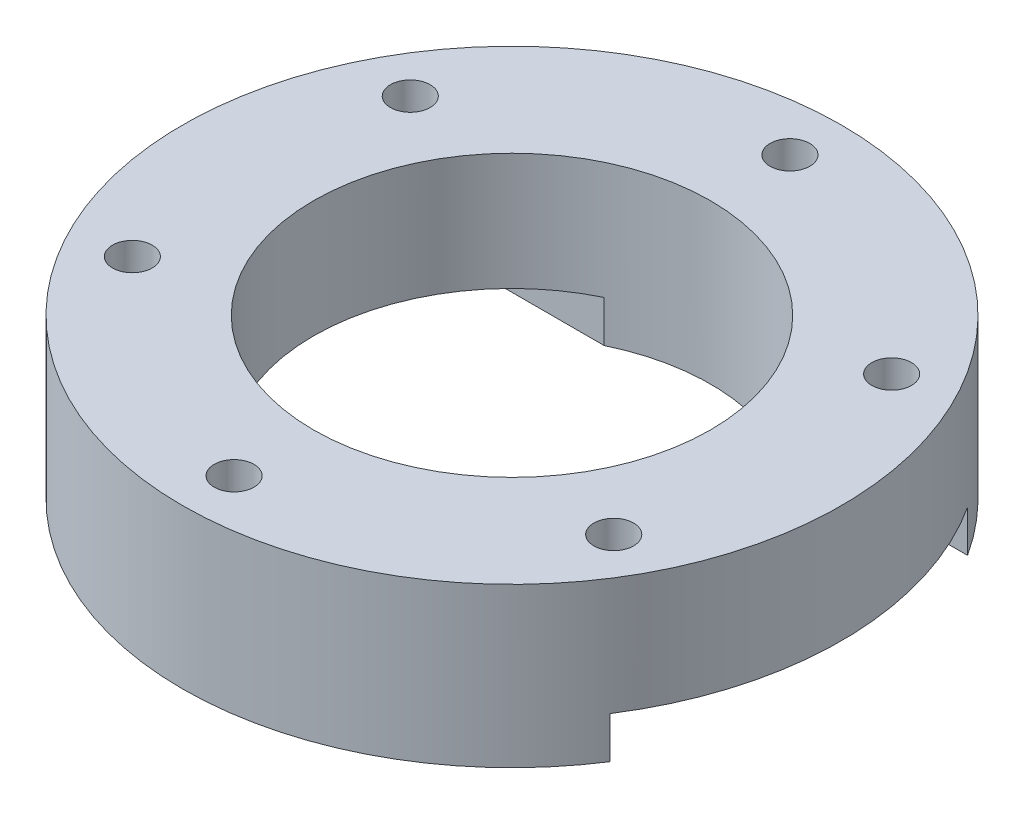
ISO-10303-21;
HEADER;
FILE_DESCRIPTION(('STEP AP214'),'2;1');
FILE_NAME('part.step','',(''),(''),'','','');
FILE_SCHEMA(('AUTOMOTIVE_DESIGN { 1 0 10303 214 1 1 1 1 }'));
ENDSEC;
DATA;
#1=APPLICATION_CONTEXT('core data for automotive mechanical design processes');
#2=APPLICATION_PROTOCOL_DEFINITION('international standard','automotive_design',2000,#1);
#3=PRODUCT_CONTEXT('',#1,'mechanical');
#4=PRODUCT('Part','Part','',(#3));
#5=PRODUCT_RELATED_PRODUCT_CATEGORY('part','',(#4));
#6=PRODUCT_DEFINITION_FORMATION('','',#4);
#7=PRODUCT_DEFINITION_CONTEXT('part definition',#1,'design');
#8=PRODUCT_DEFINITION('design','',#6,#7);
#9=PRODUCT_DEFINITION_SHAPE('','',#8);
#10=(LENGTH_UNIT() NAMED_UNIT(*) SI_UNIT(.MILLI.,.METRE.));
#11=(NAMED_UNIT(*) PLANE_ANGLE_UNIT() SI_UNIT($,.RADIAN.));
#12=(NAMED_UNIT(*) SI_UNIT($,.STERADIAN.) SOLID_ANGLE_UNIT());
#13=UNCERTAINTY_MEASURE_WITH_UNIT(LENGTH_MEASURE(1.E-05),#10,'distance_accuracy_value','');
#14=(GEOMETRIC_REPRESENTATION_CONTEXT(3) GLOBAL_UNCERTAINTY_ASSIGNED_CONTEXT((#13)) GLOBAL_UNIT_ASSIGNED_CONTEXT((#10,
#11,#12)) REPRESENTATION_CONTEXT('',''));
#15=CARTESIAN_POINT('',(0.,0.,0.));
#16=DIRECTION('',(0.,0.,1.));
#17=DIRECTION('',(1.,0.,0.));
#18=AXIS2_PLACEMENT_3D('',#15,#16,#17);
#19=CARTESIAN_POINT('',(0.,0.,0.));
#20=DIRECTION('',(0.,1.,0.));
#21=DIRECTION('',(0.,0.,1.));
#22=AXIS2_PLACEMENT_3D('',#19,#20,#21);
#23=PLANE('',#22);
#24=CARTESIAN_POINT('',(2.97570696259839E-12,0.,35.));
#25=DIRECTION('',(0.,1.,0.));
#26=DIRECTION('',(0.,0.,1.));
#27=AXIS2_PLACEMENT_3D('',#24,#25,#26);
#28=CIRCLE('',#27,2.5);
#29=CARTESIAN_POINT('',(2.97570696259839E-12,0.,37.5));
#30=VERTEX_POINT('',#29);
#31=EDGE_CURVE('E171',#30,#30,#28,.T.);
#32=ORIENTED_EDGE('',*,*,#31,.T.);
#33=EDGE_LOOP('',(#32));
#34=FACE_BOUND('',#33,.T.);
#35=CARTESIAN_POINT('',(0.,0.,0.));
#36=DIRECTION('',(0.,1.,0.));
#37=DIRECTION('',(0.,0.,1.));
#38=AXIS2_PLACEMENT_3D('',#35,#36,#37);
#39=CIRCLE('',#38,41.5);
#40=CARTESIAN_POINT('',(-34.8711915483254,0.,22.5));
#41=VERTEX_POINT('',#40);
#42=CARTESIAN_POINT('',(34.8711915483254,0.,22.5));
#43=VERTEX_POINT('',#42);
#44=EDGE_CURVE('E125',#41,#43,#39,.T.);
#45=ORIENTED_EDGE('',*,*,#44,.F.);
#46=DIRECTION('',(-1.,0.,0.));
#47=VECTOR('',#46,1.);
#48=CARTESIAN_POINT('',(45.,0.,22.5));
#49=LINE('',#48,#47);
#50=CARTESIAN_POINT('',(-10.8972473588517,0.,22.5));
#51=VERTEX_POINT('',#50);
#52=EDGE_CURVE('E117',#51,#41,#49,.T.);
#53=ORIENTED_EDGE('',*,*,#52,.F.);
#54=CARTESIAN_POINT('',(0.,0.,0.));
#55=DIRECTION('',(0.,1.,0.));
#56=DIRECTION('',(0.,0.,1.));
#57=AXIS2_PLACEMENT_3D('',#54,#55,#56);
#58=CIRCLE('',#57,25.);
#59=CARTESIAN_POINT('',(10.8972473588517,0.,22.5));
#60=VERTEX_POINT('',#59);
#61=EDGE_CURVE('E183',#51,#60,#58,.T.);
#62=ORIENTED_EDGE('',*,*,#61,.T.);
#63=EDGE_CURVE('E271',#43,#60,#49,.T.);
#64=ORIENTED_EDGE('',*,*,#63,.F.);
#65=EDGE_LOOP('',(#45,#53,#62,#64));
#66=FACE_BOUND('',#65,.T.);
#67=ADVANCED_FACE('F33',(#34,#66),#23,.F.);
#68=CARTESIAN_POINT('',(30.3108891324561,0.,-17.5000000000013));
#69=DIRECTION('',(0.,1.,0.));
#70=DIRECTION('',(0.,0.,1.));
#71=AXIS2_PLACEMENT_3D('',#68,#69,#70);
#72=CYLINDRICAL_SURFACE('',#71,2.5);
#73=CARTESIAN_POINT('',(30.3108891324561,20.,-17.5000000000013));
#74=DIRECTION('',(0.,1.,0.));
#75=DIRECTION('',(0.,0.,1.));
#76=AXIS2_PLACEMENT_3D('',#73,#74,#75);
#77=CIRCLE('',#76,2.5);
#78=CARTESIAN_POINT('',(30.3108891324561,20.,-15.0000000000013));
#79=VERTEX_POINT('',#78);
#80=EDGE_CURVE('E179',#79,#79,#77,.T.);
#81=ORIENTED_EDGE('',*,*,#80,.T.);
#82=EDGE_LOOP('',(#81));
#83=FACE_BOUND('',#82,.T.);
#84=CARTESIAN_POINT('',(30.3108891324561,5.25,-17.5000000000013));
#85=DIRECTION('',(0.,-1.,0.));
#86=DIRECTION('',(0.,0.,-1.));
#87=AXIS2_PLACEMENT_3D('',#84,#85,#86);
#88=CIRCLE('',#87,2.5);
#89=CARTESIAN_POINT('',(30.3108891324561,5.25,-20.0000000000013));
#90=VERTEX_POINT('',#89);
#91=EDGE_CURVE('E153',#90,#90,#88,.F.);
#92=ORIENTED_EDGE('',*,*,#91,.F.);
#93=EDGE_LOOP('',(#92));
#94=FACE_BOUND('',#93,.T.);
#95=ADVANCED_FACE('F210',(#83,#94),#72,.F.);
#96=CARTESIAN_POINT('',(30.3108891324576,0.,17.4999999999987));
#97=DIRECTION('',(0.,1.,0.));
#98=DIRECTION('',(0.,0.,1.));
#99=AXIS2_PLACEMENT_3D('',#96,#97,#98);
#100=CYLINDRICAL_SURFACE('',#99,2.5);
#101=CARTESIAN_POINT('',(30.3108891324576,20.,17.4999999999987));
#102=DIRECTION('',(0.,1.,0.));
#103=DIRECTION('',(0.,0.,1.));
#104=AXIS2_PLACEMENT_3D('',#101,#102,#103);
#105=CIRCLE('',#104,2.5);
#106=CARTESIAN_POINT('',(30.3108891324576,20.,19.9999999999987));
#107=VERTEX_POINT('',#106);
#108=EDGE_CURVE('E174',#107,#107,#105,.T.);
#109=ORIENTED_EDGE('',*,*,#108,.T.);
#110=EDGE_LOOP('',(#109));
#111=FACE_BOUND('',#110,.T.);
#112=CARTESIAN_POINT('',(30.3108891324576,5.25,17.4999999999987));
#113=DIRECTION('',(0.,-1.,0.));
#114=DIRECTION('',(0.,0.,-1.));
#115=AXIS2_PLACEMENT_3D('',#112,#113,#114);
#116=CIRCLE('',#115,2.5);
#117=CARTESIAN_POINT('',(30.3108891324576,5.25,14.9999999999987));
#118=VERTEX_POINT('',#117);
#119=EDGE_CURVE('E279',#118,#118,#116,.F.);
#120=ORIENTED_EDGE('',*,*,#119,.F.);
#121=EDGE_LOOP('',(#120));
#122=FACE_BOUND('',#121,.T.);
#123=ADVANCED_FACE('F215',(#111,#122),#100,.F.);
#124=CARTESIAN_POINT('',(-30.3108891324531,0.,17.5000000000013));
#125=DIRECTION('',(0.,1.,0.));
#126=DIRECTION('',(0.,0.,1.));
#127=AXIS2_PLACEMENT_3D('',#124,#125,#126);
#128=CYLINDRICAL_SURFACE('',#127,2.5);
#129=CARTESIAN_POINT('',(-30.3108891324531,20.,17.5000000000013));
#130=DIRECTION('',(0.,1.,0.));
#131=DIRECTION('',(0.,0.,1.));
#132=AXIS2_PLACEMENT_3D('',#129,#130,#131);
#133=CIRCLE('',#132,2.5);
#134=CARTESIAN_POINT('',(-30.3108891324531,20.,20.0000000000013));
#135=VERTEX_POINT('',#134);
#136=EDGE_CURVE('E167',#135,#135,#133,.T.);
#137=ORIENTED_EDGE('',*,*,#136,.T.);
#138=EDGE_LOOP('',(#137));
#139=FACE_BOUND('',#138,.T.);
#140=CARTESIAN_POINT('',(-30.3108891324531,5.25,17.5000000000013));
#141=DIRECTION('',(0.,-1.,0.));
#142=DIRECTION('',(0.,0.,-1.));
#143=AXIS2_PLACEMENT_3D('',#140,#141,#142);
#144=CIRCLE('',#143,2.5);
#145=CARTESIAN_POINT('',(-30.3108891324531,5.25,15.0000000000013));
#146=VERTEX_POINT('',#145);
#147=EDGE_CURVE('E136',#146,#146,#144,.F.);
#148=ORIENTED_EDGE('',*,*,#147,.F.);
#149=EDGE_LOOP('',(#148));
#150=FACE_BOUND('',#149,.T.);
#151=ADVANCED_FACE('F206',(#139,#150),#128,.F.);
#152=CARTESIAN_POINT('',(-30.3108891324546,0.,-17.4999999999987));
#153=DIRECTION('',(0.,1.,0.));
#154=DIRECTION('',(0.,0.,1.));
#155=AXIS2_PLACEMENT_3D('',#152,#153,#154);
#156=CYLINDRICAL_SURFACE('',#155,2.5);
#157=CARTESIAN_POINT('',(-30.3108891324546,20.,-17.4999999999987));
#158=DIRECTION('',(0.,1.,0.));
#159=DIRECTION('',(0.,0.,1.));
#160=AXIS2_PLACEMENT_3D('',#157,#158,#159);
#161=CIRCLE('',#160,2.5);
#162=CARTESIAN_POINT('',(-30.3108891324546,20.,-14.9999999999987));
#163=VERTEX_POINT('',#162);
#164=EDGE_CURVE('E164',#163,#163,#161,.T.);
#165=ORIENTED_EDGE('',*,*,#164,.T.);
#166=EDGE_LOOP('',(#165));
#167=FACE_BOUND('',#166,.T.);
#168=CARTESIAN_POINT('',(-30.3108891324546,5.25,-17.4999999999987));
#169=DIRECTION('',(0.,-1.,0.));
#170=DIRECTION('',(0.,0.,-1.));
#171=AXIS2_PLACEMENT_3D('',#168,#169,#170);
#172=CIRCLE('',#171,2.5);
#173=CARTESIAN_POINT('',(-30.3108891324546,5.25,-19.9999999999987));
#174=VERTEX_POINT('',#173);
#175=EDGE_CURVE('E133',#174,#174,#172,.F.);
#176=ORIENTED_EDGE('',*,*,#175,.F.);
#177=EDGE_LOOP('',(#176));
#178=FACE_BOUND('',#177,.T.);
#179=ADVANCED_FACE('F202',(#167,#178),#156,.F.);
#180=CARTESIAN_POINT('',(0.,20.,0.));
#181=DIRECTION('',(0.,-1.,0.));
#182=DIRECTION('',(0.,0.,-1.));
#183=AXIS2_PLACEMENT_3D('',#180,#181,#182);
#184=CYLINDRICAL_SURFACE('',#183,41.5);
#185=ORIENTED_EDGE('',*,*,#44,.T.);
#186=DIRECTION('',(0.,-1.,0.));
#187=VECTOR('',#186,1.);
#188=CARTESIAN_POINT('',(34.8711915483254,20.,22.5));
#189=LINE('',#188,#187);
#190=CARTESIAN_POINT('',(34.8711915483254,5.25,22.5));
#191=VERTEX_POINT('',#190);
#192=EDGE_CURVE('E158',#43,#191,#189,.F.);
#193=ORIENTED_EDGE('',*,*,#192,.T.);
#194=CARTESIAN_POINT('',(0.,5.25,0.));
#195=DIRECTION('',(0.,-1.,0.));
#196=DIRECTION('',(0.,0.,-1.));
#197=AXIS2_PLACEMENT_3D('',#194,#195,#196);
#198=CIRCLE('',#197,41.5);
#199=CARTESIAN_POINT('',(34.8711915483254,5.25,-22.5));
#200=VERTEX_POINT('',#199);
#201=EDGE_CURVE('E106',#200,#191,#198,.T.);
#202=ORIENTED_EDGE('',*,*,#201,.F.);
#203=DIRECTION('',(0.,-1.,0.));
#204=VECTOR('',#203,1.);
#205=CARTESIAN_POINT('',(34.8711915483254,20.,-22.5));
#206=LINE('',#205,#204);
#207=CARTESIAN_POINT('',(34.8711915483254,0.,-22.5));
#208=VERTEX_POINT('',#207);
#209=EDGE_CURVE('E105',#200,#208,#206,.T.);
#210=ORIENTED_EDGE('',*,*,#209,.T.);
#211=CARTESIAN_POINT('',(-34.8711915483254,0.,-22.5));
#212=VERTEX_POINT('',#211);
#213=EDGE_CURVE('E114',#208,#212,#39,.T.);
#214=ORIENTED_EDGE('',*,*,#213,.T.);
#215=DIRECTION('',(0.,-1.,0.));
#216=VECTOR('',#215,1.);
#217=CARTESIAN_POINT('',(-34.8711915483254,20.,-22.5));
#218=LINE('',#217,#216);
#219=CARTESIAN_POINT('',(-34.8711915483254,5.25,-22.5));
#220=VERTEX_POINT('',#219);
#221=EDGE_CURVE('E97',#212,#220,#218,.F.);
#222=ORIENTED_EDGE('',*,*,#221,.T.);
#223=CARTESIAN_POINT('',(-34.8711915483254,5.25,22.5));
#224=VERTEX_POINT('',#223);
#225=EDGE_CURVE('E149',#224,#220,#198,.T.);
#226=ORIENTED_EDGE('',*,*,#225,.F.);
#227=DIRECTION('',(0.,-1.,0.));
#228=VECTOR('',#227,1.);
#229=CARTESIAN_POINT('',(-34.8711915483254,20.,22.5));
#230=LINE('',#229,#228);
#231=EDGE_CURVE('E161',#224,#41,#230,.T.);
#232=ORIENTED_EDGE('',*,*,#231,.T.);
#233=EDGE_LOOP('',(#185,#193,#202,#210,#214,#222,#226,#232));
#234=FACE_BOUND('',#233,.T.);
#235=CARTESIAN_POINT('',(0.,20.,0.));
#236=DIRECTION('',(0.,1.,0.));
#237=DIRECTION('',(0.,0.,1.));
#238=AXIS2_PLACEMENT_3D('',#235,#236,#237);
#239=CIRCLE('',#238,41.5);
#240=CARTESIAN_POINT('',(0.,20.,41.5));
#241=VERTEX_POINT('',#240);
#242=EDGE_CURVE('E124',#241,#241,#239,.T.);
#243=ORIENTED_EDGE('',*,*,#242,.F.);
#244=EDGE_LOOP('',(#243));
#245=FACE_BOUND('',#244,.T.);
#246=ADVANCED_FACE('F35',(#234,#245),#184,.T.);
#247=CARTESIAN_POINT('',(0.,20.,0.));
#248=DIRECTION('',(0.,1.,0.));
#249=DIRECTION('',(0.,0.,1.));
#250=AXIS2_PLACEMENT_3D('',#247,#248,#249);
#251=PLANE('',#250);
#252=ORIENTED_EDGE('',*,*,#164,.F.);
#253=EDGE_LOOP('',(#252));
#254=FACE_BOUND('',#253,.T.);
#255=ORIENTED_EDGE('',*,*,#136,.F.);
#256=EDGE_LOOP('',(#255));
#257=FACE_BOUND('',#256,.T.);
#258=CARTESIAN_POINT('',(2.97570696259839E-12,20.,35.));
#259=DIRECTION('',(0.,1.,0.));
#260=DIRECTION('',(0.,0.,1.));
#261=AXIS2_PLACEMENT_3D('',#258,#259,#260);
#262=CIRCLE('',#261,2.5);
#263=CARTESIAN_POINT('',(2.97570696259839E-12,20.,37.5));
#264=VERTEX_POINT('',#263);
#265=EDGE_CURVE('E170',#264,#264,#262,.T.);
#266=ORIENTED_EDGE('',*,*,#265,.F.);
#267=EDGE_LOOP('',(#266));
#268=FACE_BOUND('',#267,.T.);
#269=ORIENTED_EDGE('',*,*,#108,.F.);
#270=EDGE_LOOP('',(#269));
#271=FACE_BOUND('',#270,.T.);
#272=ORIENTED_EDGE('',*,*,#80,.F.);
#273=EDGE_LOOP('',(#272));
#274=FACE_BOUND('',#273,.T.);
#275=CARTESIAN_POINT('',(0.,20.,0.));
#276=DIRECTION('',(0.,1.,0.));
#277=DIRECTION('',(0.,0.,1.));
#278=AXIS2_PLACEMENT_3D('',#275,#276,#277);
#279=CIRCLE('',#278,25.);
#280=CARTESIAN_POINT('',(0.,20.,25.));
#281=VERTEX_POINT('',#280);
#282=EDGE_CURVE('E182',#281,#281,#279,.T.);
#283=ORIENTED_EDGE('',*,*,#282,.F.);
#284=EDGE_LOOP('',(#283));
#285=FACE_BOUND('',#284,.T.);
#286=CARTESIAN_POINT('',(0.,20.,-35.));
#287=DIRECTION('',(0.,1.,0.));
#288=DIRECTION('',(0.,0.,1.));
#289=AXIS2_PLACEMENT_3D('',#286,#287,#288);
#290=CIRCLE('',#289,2.5);
#291=CARTESIAN_POINT('',(0.,20.,-32.5));
#292=VERTEX_POINT('',#291);
#293=EDGE_CURVE('E189',#292,#292,#290,.T.);
#294=ORIENTED_EDGE('',*,*,#293,.F.);
#295=EDGE_LOOP('',(#294));
#296=FACE_BOUND('',#295,.T.);
#297=ORIENTED_EDGE('',*,*,#242,.T.);
#298=EDGE_LOOP('',(#297));
#299=FACE_BOUND('',#298,.T.);
#300=ADVANCED_FACE('F195',(#254,#257,#268,#271,#274,#285,#296,#299),#251,.T.);
#301=ORIENTED_EDGE('',*,*,#213,.F.);
#302=DIRECTION('',(1.,0.,0.));
#303=VECTOR('',#302,1.);
#304=CARTESIAN_POINT('',(45.,0.,-22.5));
#305=LINE('',#304,#303);
#306=CARTESIAN_POINT('',(10.8972473588517,0.,-22.5));
#307=VERTEX_POINT('',#306);
#308=EDGE_CURVE('E118',#307,#208,#305,.T.);
#309=ORIENTED_EDGE('',*,*,#308,.F.);
#310=CARTESIAN_POINT('',(-10.8972473588517,0.,-22.5));
#311=VERTEX_POINT('',#310);
#312=EDGE_CURVE('E116',#307,#311,#58,.T.);
#313=ORIENTED_EDGE('',*,*,#312,.T.);
#314=EDGE_CURVE('E100',#212,#311,#305,.T.);
#315=ORIENTED_EDGE('',*,*,#314,.F.);
#316=EDGE_LOOP('',(#301,#309,#313,#315));
#317=FACE_BOUND('',#316,.T.);
#318=CARTESIAN_POINT('',(0.,0.,-35.));
#319=DIRECTION('',(0.,1.,0.));
#320=DIRECTION('',(0.,0.,1.));
#321=AXIS2_PLACEMENT_3D('',#318,#319,#320);
#322=CIRCLE('',#321,2.5);
#323=CARTESIAN_POINT('',(0.,0.,-32.5));
#324=VERTEX_POINT('',#323);
#325=EDGE_CURVE('E130',#324,#324,#322,.T.);
#326=ORIENTED_EDGE('',*,*,#325,.T.);
#327=EDGE_LOOP('',(#326));
#328=FACE_BOUND('',#327,.T.);
#329=ADVANCED_FACE('F111',(#317,#328),#23,.F.);
#330=CARTESIAN_POINT('',(0.,0.,-35.));
#331=DIRECTION('',(0.,1.,0.));
#332=DIRECTION('',(0.,0.,1.));
#333=AXIS2_PLACEMENT_3D('',#330,#331,#332);
#334=CYLINDRICAL_SURFACE('',#333,2.5);
#335=ORIENTED_EDGE('',*,*,#325,.F.);
#336=EDGE_LOOP('',(#335));
#337=FACE_BOUND('',#336,.T.);
#338=ORIENTED_EDGE('',*,*,#293,.T.);
#339=EDGE_LOOP('',(#338));
#340=FACE_BOUND('',#339,.T.);
#341=ADVANCED_FACE('F193',(#337,#340),#334,.F.);
#342=CARTESIAN_POINT('',(0.,0.,0.));
#343=DIRECTION('',(0.,1.,0.));
#344=DIRECTION('',(0.,0.,1.));
#345=AXIS2_PLACEMENT_3D('',#342,#343,#344);
#346=CYLINDRICAL_SURFACE('',#345,25.);
#347=ORIENTED_EDGE('',*,*,#61,.F.);
#348=DIRECTION('',(0.,1.,0.));
#349=VECTOR('',#348,1.);
#350=CARTESIAN_POINT('',(-10.8972473588517,0.,22.5));
#351=LINE('',#350,#349);
#352=CARTESIAN_POINT('',(-10.8972473588517,5.25,22.5));
#353=VERTEX_POINT('',#352);
#354=EDGE_CURVE('E11',#51,#353,#351,.T.);
#355=ORIENTED_EDGE('',*,*,#354,.T.);
#356=CARTESIAN_POINT('',(0.,5.25,0.));
#357=DIRECTION('',(0.,-1.,0.));
#358=DIRECTION('',(0.,0.,-1.));
#359=AXIS2_PLACEMENT_3D('',#356,#357,#358);
#360=CIRCLE('',#359,25.);
#361=CARTESIAN_POINT('',(-10.8972473588517,5.25,-22.5));
#362=VERTEX_POINT('',#361);
#363=EDGE_CURVE('E146',#362,#353,#360,.F.);
#364=ORIENTED_EDGE('',*,*,#363,.F.);
#365=DIRECTION('',(0.,1.,0.));
#366=VECTOR('',#365,1.);
#367=CARTESIAN_POINT('',(-10.8972473588517,0.,-22.5));
#368=LINE('',#367,#366);
#369=EDGE_CURVE('E41',#362,#311,#368,.F.);
#370=ORIENTED_EDGE('',*,*,#369,.T.);
#371=ORIENTED_EDGE('',*,*,#312,.F.);
#372=DIRECTION('',(0.,1.,0.));
#373=VECTOR('',#372,1.);
#374=CARTESIAN_POINT('',(10.8972473588517,0.,-22.5));
#375=LINE('',#374,#373);
#376=CARTESIAN_POINT('',(10.8972473588517,5.25,-22.5));
#377=VERTEX_POINT('',#376);
#378=EDGE_CURVE('E128',#307,#377,#375,.T.);
#379=ORIENTED_EDGE('',*,*,#378,.T.);
#380=CARTESIAN_POINT('',(10.8972473588517,5.25,22.5));
#381=VERTEX_POINT('',#380);
#382=EDGE_CURVE('E150',#381,#377,#360,.F.);
#383=ORIENTED_EDGE('',*,*,#382,.F.);
#384=DIRECTION('',(0.,1.,0.));
#385=VECTOR('',#384,1.);
#386=CARTESIAN_POINT('',(10.8972473588517,0.,22.5));
#387=LINE('',#386,#385);
#388=EDGE_CURVE('E139',#381,#60,#387,.F.);
#389=ORIENTED_EDGE('',*,*,#388,.T.);
#390=EDGE_LOOP('',(#347,#355,#364,#370,#371,#379,#383,#389));
#391=FACE_BOUND('',#390,.T.);
#392=ORIENTED_EDGE('',*,*,#282,.T.);
#393=EDGE_LOOP('',(#392));
#394=FACE_BOUND('',#393,.T.);
#395=ADVANCED_FACE('F144',(#391,#394),#346,.F.);
#396=CARTESIAN_POINT('',(2.97570696259839E-12,0.,35.));
#397=DIRECTION('',(0.,1.,0.));
#398=DIRECTION('',(0.,0.,1.));
#399=AXIS2_PLACEMENT_3D('',#396,#397,#398);
#400=CYLINDRICAL_SURFACE('',#399,2.5);
#401=ORIENTED_EDGE('',*,*,#31,.F.);
#402=EDGE_LOOP('',(#401));
#403=FACE_BOUND('',#402,.T.);
#404=ORIENTED_EDGE('',*,*,#265,.T.);
#405=EDGE_LOOP('',(#404));
#406=FACE_BOUND('',#405,.T.);
#407=ADVANCED_FACE('F228',(#403,#406),#400,.F.);
#408=CARTESIAN_POINT('',(0.,5.25,0.));
#409=DIRECTION('',(0.,-1.,0.));
#410=DIRECTION('',(0.,0.,-1.));
#411=AXIS2_PLACEMENT_3D('',#408,#409,#410);
#412=PLANE('',#411);
#413=ORIENTED_EDGE('',*,*,#175,.T.);
#414=EDGE_LOOP('',(#413));
#415=FACE_BOUND('',#414,.T.);
#416=ORIENTED_EDGE('',*,*,#147,.T.);
#417=EDGE_LOOP('',(#416));
#418=FACE_BOUND('',#417,.T.);
#419=ORIENTED_EDGE('',*,*,#225,.T.);
#420=DIRECTION('',(1.,0.,0.));
#421=VECTOR('',#420,1.);
#422=CARTESIAN_POINT('',(45.,5.25,-22.5));
#423=LINE('',#422,#421);
#424=EDGE_CURVE('E48',#220,#362,#423,.T.);
#425=ORIENTED_EDGE('',*,*,#424,.T.);
#426=ORIENTED_EDGE('',*,*,#363,.T.);
#427=DIRECTION('',(-1.,0.,0.));
#428=VECTOR('',#427,1.);
#429=CARTESIAN_POINT('',(45.,5.25,22.5));
#430=LINE('',#429,#428);
#431=EDGE_CURVE('E267',#353,#224,#430,.T.);
#432=ORIENTED_EDGE('',*,*,#431,.T.);
#433=EDGE_LOOP('',(#419,#425,#426,#432));
#434=FACE_BOUND('',#433,.T.);
#435=ADVANCED_FACE('F237',(#415,#418,#434),#412,.T.);
#436=CARTESIAN_POINT('',(45.,5.25,-22.5));
#437=DIRECTION('',(0.,0.,-1.));
#438=DIRECTION('',(-1.,0.,0.));
#439=AXIS2_PLACEMENT_3D('',#436,#437,#438);
#440=PLANE('',#439);
#441=ORIENTED_EDGE('',*,*,#314,.T.);
#442=ORIENTED_EDGE('',*,*,#369,.F.);
#443=ORIENTED_EDGE('',*,*,#424,.F.);
#444=ORIENTED_EDGE('',*,*,#221,.F.);
#445=EDGE_LOOP('',(#441,#442,#443,#444));
#446=FACE_BOUND('',#445,.T.);
#447=ADVANCED_FACE('F99',(#446),#440,.F.);
#448=CARTESIAN_POINT('',(45.,5.25,22.5));
#449=DIRECTION('',(0.,0.,1.));
#450=DIRECTION('',(1.,0.,0.));
#451=AXIS2_PLACEMENT_3D('',#448,#449,#450);
#452=PLANE('',#451);
#453=ORIENTED_EDGE('',*,*,#431,.F.);
#454=ORIENTED_EDGE('',*,*,#354,.F.);
#455=ORIENTED_EDGE('',*,*,#52,.T.);
#456=ORIENTED_EDGE('',*,*,#231,.F.);
#457=EDGE_LOOP('',(#453,#454,#455,#456));
#458=FACE_BOUND('',#457,.T.);
#459=ADVANCED_FACE('F248',(#458),#452,.F.);
#460=ORIENTED_EDGE('',*,*,#63,.T.);
#461=ORIENTED_EDGE('',*,*,#388,.F.);
#462=EDGE_CURVE('E56',#191,#381,#430,.T.);
#463=ORIENTED_EDGE('',*,*,#462,.F.);
#464=ORIENTED_EDGE('',*,*,#192,.F.);
#465=EDGE_LOOP('',(#460,#461,#463,#464));
#466=FACE_BOUND('',#465,.T.);
#467=ADVANCED_FACE('F246',(#466),#452,.F.);
#468=EDGE_CURVE('E273',#377,#200,#423,.T.);
#469=ORIENTED_EDGE('',*,*,#468,.F.);
#470=ORIENTED_EDGE('',*,*,#378,.F.);
#471=ORIENTED_EDGE('',*,*,#308,.T.);
#472=ORIENTED_EDGE('',*,*,#209,.F.);
#473=EDGE_LOOP('',(#469,#470,#471,#472));
#474=FACE_BOUND('',#473,.T.);
#475=ADVANCED_FACE('F242',(#474),#440,.F.);
#476=ORIENTED_EDGE('',*,*,#119,.T.);
#477=EDGE_LOOP('',(#476));
#478=FACE_BOUND('',#477,.T.);
#479=ORIENTED_EDGE('',*,*,#91,.T.);
#480=EDGE_LOOP('',(#479));
#481=FACE_BOUND('',#480,.T.);
#482=ORIENTED_EDGE('',*,*,#201,.T.);
#483=ORIENTED_EDGE('',*,*,#462,.T.);
#484=ORIENTED_EDGE('',*,*,#382,.T.);
#485=ORIENTED_EDGE('',*,*,#468,.T.);
#486=EDGE_LOOP('',(#482,#483,#484,#485));
#487=FACE_BOUND('',#486,.T.);
#488=ADVANCED_FACE('F245',(#478,#481,#487),#412,.T.);
#489=CLOSED_SHELL('',(#67,#95,#123,#151,#179,#246,#300,#329,#341,#395,#407,#435,#447,#459,#467,
#475,#488));
#490=MANIFOLD_SOLID_BREP('B2',#489);
#491=ADVANCED_BREP_SHAPE_REPRESENTATION('',(#18,#490),#14);
#492=SHAPE_DEFINITION_REPRESENTATION(#9,#491);
ENDSEC;
END-ISO-10303-21;
